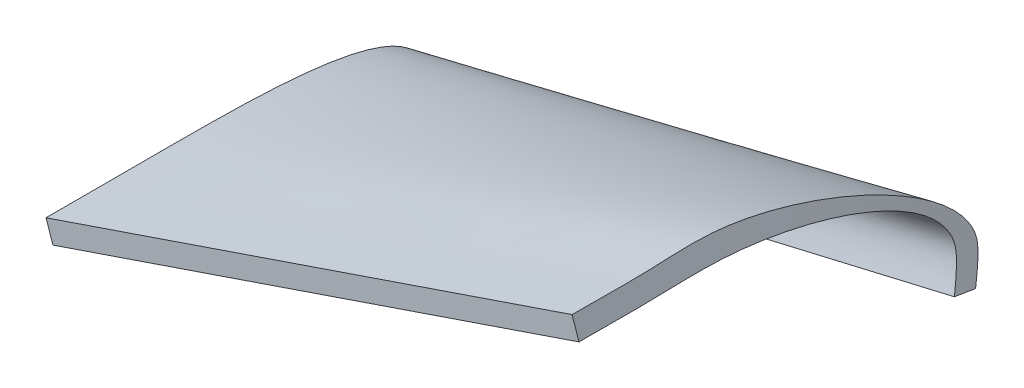
ISO-10303-21;
HEADER;
FILE_DESCRIPTION(('STEP AP214'),'2;1');
FILE_NAME('part.step','',(''),(''),'','','');
FILE_SCHEMA(('AUTOMOTIVE_DESIGN { 1 0 10303 214 1 1 1 1 }'));
ENDSEC;
DATA;
#1=APPLICATION_CONTEXT('core data for automotive mechanical design processes');
#2=APPLICATION_PROTOCOL_DEFINITION('international standard','automotive_design',2000,#1);
#3=PRODUCT_CONTEXT('',#1,'mechanical');
#4=PRODUCT('Part','Part','',(#3));
#5=PRODUCT_RELATED_PRODUCT_CATEGORY('part','',(#4));
#6=PRODUCT_DEFINITION_FORMATION('','',#4);
#7=PRODUCT_DEFINITION_CONTEXT('part definition',#1,'design');
#8=PRODUCT_DEFINITION('design','',#6,#7);
#9=PRODUCT_DEFINITION_SHAPE('','',#8);
#10=(LENGTH_UNIT() NAMED_UNIT(*) SI_UNIT(.MILLI.,.METRE.));
#11=(NAMED_UNIT(*) PLANE_ANGLE_UNIT() SI_UNIT($,.RADIAN.));
#12=(NAMED_UNIT(*) SI_UNIT($,.STERADIAN.) SOLID_ANGLE_UNIT());
#13=UNCERTAINTY_MEASURE_WITH_UNIT(LENGTH_MEASURE(1.E-05),#10,'distance_accuracy_value','');
#14=(GEOMETRIC_REPRESENTATION_CONTEXT(3) GLOBAL_UNCERTAINTY_ASSIGNED_CONTEXT((#13)) GLOBAL_UNIT_ASSIGNED_CONTEXT((#10,
#11,#12)) REPRESENTATION_CONTEXT('',''));
#15=CARTESIAN_POINT('',(0.,0.,0.));
#16=DIRECTION('',(0.,0.,1.));
#17=DIRECTION('',(1.,0.,0.));
#18=AXIS2_PLACEMENT_3D('',#15,#16,#17);
#19=CARTESIAN_POINT('',(-579.300819340137,52.2412064798877,-103.328639897074));
#20=DIRECTION('',(-0.207562785667459,0.965766665488504,-0.155603463448537));
#21=DIRECTION('',(-0.977675139751499,-0.21012215759383,0.));
#22=AXIS2_PLACEMENT_3D('',#19,#20,#21);
#23=PLANE('',#22);
#24=DIRECTION('',(0.00214335401872304,-0.15861831128964,-0.987337651139251));
#25=VECTOR('',#24,1.);
#26=CARTESIAN_POINT('',(-579.287209009447,51.2339777854459,-109.598249031383));
#27=LINE('',#26,#25);
#28=CARTESIAN_POINT('',(-579.300819340137,52.2412064798877,-103.328639897074));
#29=VERTEX_POINT('',#28);
#30=CARTESIAN_POINT('',(-579.287209009447,51.2339777854459,-109.598249031383));
#31=VERTEX_POINT('',#30);
#32=EDGE_CURVE('E287',#29,#31,#27,.T.);
#33=ORIENTED_EDGE('',*,*,#32,.T.);
#34=DIRECTION('',(0.978219349655033,0.205268066573539,-0.0308532786855163));
#35=VECTOR('',#34,1.);
#36=CARTESIAN_POINT('',(-579.287209009447,51.2339777854459,-109.598249031383));
#37=LINE('',#36,#35);
#38=CARTESIAN_POINT('',(-420.267489818465,84.602434785311,-114.613770053761));
#39=VERTEX_POINT('',#38);
#40=EDGE_CURVE('E199',#31,#39,#37,.T.);
#41=ORIENTED_EDGE('',*,*,#40,.T.);
#42=DIRECTION('',(-0.0021433540187318,0.15861831128964,0.987337651139251));
#43=VECTOR('',#42,1.);
#44=CARTESIAN_POINT('',(-420.267489818465,84.602434785311,-114.613770053761));
#45=LINE('',#44,#43);
#46=CARTESIAN_POINT('',(-420.281100149154,85.6096634797528,-108.344160919452));
#47=VERTEX_POINT('',#46);
#48=EDGE_CURVE('E79',#39,#47,#45,.T.);
#49=ORIENTED_EDGE('',*,*,#48,.T.);
#50=DIRECTION('',(-0.978219349655033,-0.205268066573539,0.0308532786855166));
#51=VECTOR('',#50,1.);
#52=CARTESIAN_POINT('',(-579.300819340137,52.2412064798877,-103.328639897074));
#53=LINE('',#52,#51);
#54=EDGE_CURVE('E84',#47,#29,#53,.T.);
#55=ORIENTED_EDGE('',*,*,#54,.T.);
#56=EDGE_LOOP('',(#33,#41,#49,#55));
#57=FACE_BOUND('',#56,.T.);
#58=ADVANCED_FACE('F42',(#57),#23,.F.);
#59=CARTESIAN_POINT('',(-423.469931206114,126.579907115653,0.));
#60=DIRECTION('',(0.,0.,-1.));
#61=DIRECTION('',(-1.,0.,0.));
#62=AXIS2_PLACEMENT_3D('',#59,#60,#61);
#63=PLANE('',#62);
#64=DIRECTION('',(-0.322399616776356,0.946603658931476,0.));
#65=VECTOR('',#64,1.);
#66=CARTESIAN_POINT('',(-425.517168772643,132.590840349868,0.));
#67=LINE('',#66,#65);
#68=CARTESIAN_POINT('',(-423.469931206114,126.579907115653,0.));
#69=VERTEX_POINT('',#68);
#70=CARTESIAN_POINT('',(-425.517168772643,132.590840349868,0.));
#71=VERTEX_POINT('',#70);
#72=EDGE_CURVE('E97',#69,#71,#67,.T.);
#73=ORIENTED_EDGE('',*,*,#72,.T.);
#74=DIRECTION('',(-0.946603658931477,-0.322399616776355,0.));
#75=VECTOR('',#74,1.);
#76=CARTESIAN_POINT('',(-581.788076139738,79.3672127280231,0.));
#77=LINE('',#76,#75);
#78=CARTESIAN_POINT('',(-581.788076139738,79.3672127280231,0.));
#79=VERTEX_POINT('',#78);
#80=EDGE_CURVE('E12',#71,#79,#77,.T.);
#81=ORIENTED_EDGE('',*,*,#80,.T.);
#82=DIRECTION('',(0.322399616776364,-0.946603658931474,0.));
#83=VECTOR('',#82,1.);
#84=CARTESIAN_POINT('',(-579.740838573208,73.3562794938083,0.));
#85=LINE('',#84,#83);
#86=CARTESIAN_POINT('',(-579.740838573208,73.3562794938083,0.));
#87=VERTEX_POINT('',#86);
#88=EDGE_CURVE('E53',#79,#87,#85,.T.);
#89=ORIENTED_EDGE('',*,*,#88,.T.);
#90=DIRECTION('',(0.946603658931477,0.322399616776355,0.));
#91=VECTOR('',#90,1.);
#92=CARTESIAN_POINT('',(-423.469931206114,126.579907115653,0.));
#93=LINE('',#92,#91);
#94=EDGE_CURVE('E62',#87,#69,#93,.T.);
#95=ORIENTED_EDGE('',*,*,#94,.T.);
#96=EDGE_LOOP('',(#73,#81,#89,#95));
#97=FACE_BOUND('',#96,.T.);
#98=ADVANCED_FACE('F112',(#97),#63,.F.);
#99=CARTESIAN_POINT('',(-425.517168772643,132.590840349868,0.));
#100=CARTESIAN_POINT('',(-425.517168772643,132.590840349868,-7.29339145085368));
#101=CARTESIAN_POINT('',(-425.518101458164,132.180200188548,-22.2775853733354));
#102=CARTESIAN_POINT('',(-425.510754784445,135.414773059038,-57.4467769624574));
#103=CARTESIAN_POINT('',(-425.571410850307,108.709290744914,-118.743086594855));
#104=CARTESIAN_POINT('',(-421.997137935972,92.1315135216705,-117.557103297061));
#105=CARTESIAN_POINT('',(-420.267489818465,84.602434785311,-114.613770053761));
#106=CARTESIAN_POINT('',(-424.834756250467,130.587195938463,0.));
#107=CARTESIAN_POINT('',(-424.834756250467,130.587195938463,-7.29339145085368));
#108=CARTESIAN_POINT('',(-424.847829796403,130.21830015241,-22.239922614307));
#109=CARTESIAN_POINT('',(-424.744850738361,133.124056612687,-57.7057801169375));
#110=CARTESIAN_POINT('',(-425.59507286146,109.133368856955,-116.552738127461));
#111=CARTESIAN_POINT('',(-422.015868685535,92.5068029070358,-115.440074739727));
#112=CARTESIAN_POINT('',(-420.272026595362,84.9381776834583,-112.523900342324));
#113=CARTESIAN_POINT('',(-424.15234372829,128.583551527058,0.));
#114=CARTESIAN_POINT('',(-424.15234372829,128.583551527058,-7.29339145085368));
#115=CARTESIAN_POINT('',(-424.177558134642,128.256400116272,-22.2022598552786));
#116=CARTESIAN_POINT('',(-423.978946692278,130.833340166337,-57.9647832714175));
#117=CARTESIAN_POINT('',(-425.618734872612,109.557446968997,-114.362389660067));
#118=CARTESIAN_POINT('',(-422.034599435099,92.8820922924011,-113.323046182393));
#119=CARTESIAN_POINT('',(-420.276563372258,85.2739205816055,-110.434030630888));
#120=CARTESIAN_POINT('',(-423.469931206114,126.579907115653,0.));
#121=CARTESIAN_POINT('',(-423.469931206114,126.579907115653,-7.29339145085368));
#122=CARTESIAN_POINT('',(-423.507286472882,126.294500080134,-22.1645970962502));
#123=CARTESIAN_POINT('',(-423.213042646194,128.542623719986,-58.2237864258976));
#124=CARTESIAN_POINT('',(-425.642396883764,109.981525081038,-112.172041192672));
#125=CARTESIAN_POINT('',(-422.053330184662,93.2573816777664,-111.206017625059));
#126=CARTESIAN_POINT('',(-420.281100149154,85.6096634797528,-108.344160919452));
#127=B_SPLINE_SURFACE_WITH_KNOTS('',3,3,((#99,#100,#101,#102,#103,#104,#105),(#106,#107,#108,
#109,#110,#111,#112),(#113,#114,#115,#116,#117,#118,#119),(#120,#121,#122,#123,#124,#125,#126)),
.UNSPECIFIED.,.F.,.F.,.F.,(4,4),(4,1,1,1,4),(0.,1.),(0.,0.170627361361101,0.341254722722189,
0.896010158461833,1.),.UNSPECIFIED.);
#128=CARTESIAN_POINT('',(-423.469931206114,126.579907115653,0.));
#129=CARTESIAN_POINT('',(-423.469931206114,126.579907115653,-7.29339145085368));
#130=CARTESIAN_POINT('',(-423.507286472882,126.294500080134,-22.1645970962502));
#131=CARTESIAN_POINT('',(-423.213042646194,128.542623719986,-58.2237864258976));
#132=CARTESIAN_POINT('',(-425.642396883764,109.981525081038,-112.172041192672));
#133=CARTESIAN_POINT('',(-422.053330184662,93.2573816777664,-111.206017625059));
#134=CARTESIAN_POINT('',(-420.281100149154,85.6096634797528,-108.344160919452));
#135=B_SPLINE_CURVE_WITH_KNOTS('',3,(#128,#129,#130,#131,#132,#133,#134),.UNSPECIFIED.,.F.,.F.,
(4,1,1,1,4),(0.,0.170627361361101,0.341254722722189,0.896010158461833,1.),.UNSPECIFIED.);
#136=EDGE_CURVE('E103',#69,#47,#135,.T.);
#137=CARTESIAN_POINT('',(-425.517168772643,132.590840349868,0.));
#138=CARTESIAN_POINT('',(-425.517168772643,132.590840349868,-7.29339145085368));
#139=CARTESIAN_POINT('',(-425.518101458164,132.180200188548,-22.2775853733354));
#140=CARTESIAN_POINT('',(-425.510754784445,135.414773059038,-57.4467769624574));
#141=CARTESIAN_POINT('',(-425.571410850307,108.709290744914,-118.743086594855));
#142=CARTESIAN_POINT('',(-421.997137935972,92.1315135216705,-117.557103297061));
#143=CARTESIAN_POINT('',(-420.267489818465,84.602434785311,-114.613770053761));
#144=B_SPLINE_CURVE_WITH_KNOTS('',3,(#137,#138,#139,#140,#141,#142,#143),.UNSPECIFIED.,.F.,.F.,
(4,1,1,1,4),(0.,0.170627361361101,0.341254722722189,0.896010158461833,1.),.UNSPECIFIED.);
#145=EDGE_CURVE('E94',#39,#71,#144,.F.);
#146=ORIENTED_EDGE('',*,*,#72,.F.);
#147=ORIENTED_EDGE('',*,*,#136,.T.);
#148=ORIENTED_EDGE('',*,*,#48,.F.);
#149=ORIENTED_EDGE('',*,*,#145,.T.);
#150=EDGE_LOOP('',(#146,#147,#148,#149));
#151=FACE_BOUND('',#150,.T.);
#152=ADVANCED_FACE('F95',(#151),#127,.T.);
#153=CARTESIAN_POINT('',(-423.469931206114,126.579907115653,0.));
#154=CARTESIAN_POINT('',(-423.469931206114,126.579907115653,-7.29339145085368));
#155=CARTESIAN_POINT('',(-423.507286472882,126.294500080134,-22.1645970962502));
#156=CARTESIAN_POINT('',(-423.213042646194,128.542623719986,-58.2237864258976));
#157=CARTESIAN_POINT('',(-425.642396883764,109.981525081038,-112.172041192672));
#158=CARTESIAN_POINT('',(-422.053330184662,93.2573816777664,-111.206017625059));
#159=CARTESIAN_POINT('',(-420.281100149154,85.6096634797528,-108.344160919452));
#160=CARTESIAN_POINT('',(-475.560233661812,108.838697908371,0.));
#161=CARTESIAN_POINT('',(-475.560233661812,108.838697908371,-7.29339145085368));
#162=CARTESIAN_POINT('',(-475.613620604471,108.666264519705,-22.1446044517832));
#163=CARTESIAN_POINT('',(-475.193096815931,110.024505659964,-58.3612739100052));
#164=CARTESIAN_POINT('',(-478.665051552206,98.8105104272627,-111.009331415235));
#165=CARTESIAN_POINT('',(-475.082407209979,82.3593762606973,-109.28912522932));
#166=CARTESIAN_POINT('',(-473.287673212815,74.4868444797978,-106.672320578659));
#167=CARTESIAN_POINT('',(-527.65053611751,91.0974887010898,0.));
#168=CARTESIAN_POINT('',(-527.65053611751,91.0974887010898,-7.29339145085368));
#169=CARTESIAN_POINT('',(-527.71995473606,91.0380289592755,-22.1246118073161));
#170=CARTESIAN_POINT('',(-527.173150985669,91.5063875999419,-58.4987613941128));
#171=CARTESIAN_POINT('',(-531.687706220647,87.6394957734875,-109.846621637798));
#172=CARTESIAN_POINT('',(-528.111484235297,71.4613708436282,-107.372232833582));
#173=CARTESIAN_POINT('',(-526.294246276476,63.3640254798427,-105.000480237866));
#174=CARTESIAN_POINT('',(-579.740838573208,73.3562794938083,0.));
#175=CARTESIAN_POINT('',(-579.740838573208,73.3562794938083,-7.29339145085368));
#176=CARTESIAN_POINT('',(-579.82628886765,73.4097933988461,-22.104619162849));
#177=CARTESIAN_POINT('',(-579.153205155406,72.9882695399199,-58.6362488782205));
#178=CARTESIAN_POINT('',(-584.710360889088,76.4684811197122,-108.68391186036));
#179=CARTESIAN_POINT('',(-581.140561260614,60.563365426559,-105.455340437844));
#180=CARTESIAN_POINT('',(-579.300819340137,52.2412064798877,-103.328639897074));
#181=B_SPLINE_SURFACE_WITH_KNOTS('',3,3,((#153,#154,#155,#156,#157,#158,#159),(#160,#161,#162,
#163,#164,#165,#166),(#167,#168,#169,#170,#171,#172,#173),(#174,#175,#176,#177,#178,#179,#180)),
.UNSPECIFIED.,.F.,.F.,.F.,(4,4),(4,1,1,1,4),(0.,1.),(0.,0.170627361361101,0.341254722722189,
0.896010158461833,1.),.UNSPECIFIED.);
#182=CARTESIAN_POINT('',(-579.740838573208,73.3562794938083,0.));
#183=CARTESIAN_POINT('',(-579.740838573208,73.3562794938083,-7.29339145085368));
#184=CARTESIAN_POINT('',(-579.82628886765,73.4097933988461,-22.104619162849));
#185=CARTESIAN_POINT('',(-579.153205155406,72.9882695399199,-58.6362488782205));
#186=CARTESIAN_POINT('',(-584.710360889088,76.4684811197122,-108.68391186036));
#187=CARTESIAN_POINT('',(-581.140561260614,60.563365426559,-105.455340437844));
#188=CARTESIAN_POINT('',(-579.300819340137,52.2412064798877,-103.328639897074));
#189=B_SPLINE_CURVE_WITH_KNOTS('',3,(#182,#183,#184,#185,#186,#187,#188),.UNSPECIFIED.,.F.,.F.,
(4,1,1,1,4),(0.,0.170627361361101,0.341254722722189,0.896010158461833,1.),.UNSPECIFIED.);
#190=EDGE_CURVE('E104',#87,#29,#189,.T.);
#191=ORIENTED_EDGE('',*,*,#94,.F.);
#192=ORIENTED_EDGE('',*,*,#190,.T.);
#193=ORIENTED_EDGE('',*,*,#54,.F.);
#194=ORIENTED_EDGE('',*,*,#136,.F.);
#195=EDGE_LOOP('',(#191,#192,#193,#194));
#196=FACE_BOUND('',#195,.T.);
#197=ADVANCED_FACE('F220',(#196),#181,.T.);
#198=CARTESIAN_POINT('',(-581.788076139738,79.3672127280231,0.));
#199=CARTESIAN_POINT('',(-581.788076139738,79.3672127280231,-7.29339145085368));
#200=CARTESIAN_POINT('',(-581.836636831491,79.2974406833996,-22.2098986634519));
#201=CARTESIAN_POINT('',(-581.45412895498,79.8470283368158,-57.9122519257494));
#202=CARTESIAN_POINT('',(-584.612214346833,75.3094884680262,-114.806638892109));
#203=CARTESIAN_POINT('',(-581.094658286588,59.3945976766728,-111.976263533899));
#204=CARTESIAN_POINT('',(-579.287209009447,51.2339777854459,-109.598249031383));
#205=CARTESIAN_POINT('',(-529.69777368404,97.1084219353046,0.));
#206=CARTESIAN_POINT('',(-529.69777368404,97.1084219353046,-7.29339145085368));
#207=CARTESIAN_POINT('',(-529.730458373715,96.9250271851158,-22.2324609000797));
#208=CARTESIAN_POINT('',(-529.473004231468,98.3696099108898,-57.7570936046521));
#209=CARTESIAN_POINT('',(-531.598613181324,86.4427558936554,-116.118788126358));
#210=CARTESIAN_POINT('',(-528.062151503049,70.3069029583387,-113.836543454953));
#211=CARTESIAN_POINT('',(-526.280635945787,62.3567967854009,-111.270089372175));
#212=CARTESIAN_POINT('',(-477.607471228342,114.849631142586,0.));
#213=CARTESIAN_POINT('',(-477.607471228342,114.849631142586,-7.29339145085368));
#214=CARTESIAN_POINT('',(-477.62427991594,114.552613686832,-22.2550231367076));
#215=CARTESIAN_POINT('',(-477.491879507957,116.892191484964,-57.6019352835548));
#216=CARTESIAN_POINT('',(-478.585012015815,97.5760233192846,-117.430937360607));
#217=CARTESIAN_POINT('',(-475.029644719511,81.2192082400046,-115.696823376007));
#218=CARTESIAN_POINT('',(-473.274062882126,73.479615785356,-112.941929712968));
#219=CARTESIAN_POINT('',(-425.517168772643,132.590840349868,0.));
#220=CARTESIAN_POINT('',(-425.517168772643,132.590840349868,-7.29339145085368));
#221=CARTESIAN_POINT('',(-425.518101458164,132.180200188548,-22.2775853733354));
#222=CARTESIAN_POINT('',(-425.510754784445,135.414773059038,-57.4467769624574));
#223=CARTESIAN_POINT('',(-425.571410850307,108.709290744914,-118.743086594855));
#224=CARTESIAN_POINT('',(-421.997137935972,92.1315135216705,-117.557103297061));
#225=CARTESIAN_POINT('',(-420.267489818465,84.602434785311,-114.613770053761));
#226=B_SPLINE_SURFACE_WITH_KNOTS('',3,3,((#198,#199,#200,#201,#202,#203,#204),(#205,#206,#207,
#208,#209,#210,#211),(#212,#213,#214,#215,#216,#217,#218),(#219,#220,#221,#222,#223,#224,#225)),
.UNSPECIFIED.,.F.,.F.,.F.,(4,4),(4,1,1,1,4),(0.,1.),(0.,0.170627361361101,0.341254722722189,
0.896010158461833,1.),.UNSPECIFIED.);
#227=CARTESIAN_POINT('',(-581.788076139738,79.3672127280231,0.));
#228=CARTESIAN_POINT('',(-581.788076139738,79.3672127280231,-7.29339145085368));
#229=CARTESIAN_POINT('',(-581.836636831491,79.2974406833996,-22.2098986634519));
#230=CARTESIAN_POINT('',(-581.45412895498,79.8470283368158,-57.9122519257494));
#231=CARTESIAN_POINT('',(-584.612214346833,75.3094884680262,-114.806638892109));
#232=CARTESIAN_POINT('',(-581.094658286588,59.3945976766728,-111.976263533899));
#233=CARTESIAN_POINT('',(-579.287209009447,51.2339777854459,-109.598249031383));
#234=B_SPLINE_CURVE_WITH_KNOTS('',3,(#227,#228,#229,#230,#231,#232,#233),.UNSPECIFIED.,.F.,.F.,
(4,1,1,1,4),(0.,0.170627361361101,0.341254722722189,0.896010158461833,1.),.UNSPECIFIED.);
#235=EDGE_CURVE('E109',#79,#31,#234,.T.);
#236=ORIENTED_EDGE('',*,*,#80,.F.);
#237=ORIENTED_EDGE('',*,*,#145,.F.);
#238=ORIENTED_EDGE('',*,*,#40,.F.);
#239=ORIENTED_EDGE('',*,*,#235,.F.);
#240=EDGE_LOOP('',(#236,#237,#238,#239));
#241=FACE_BOUND('',#240,.T.);
#242=ADVANCED_FACE('F108',(#241),#226,.T.);
#243=CARTESIAN_POINT('',(-579.740838573208,73.3562794938083,0.));
#244=CARTESIAN_POINT('',(-579.740838573208,73.3562794938083,-7.29339145085368));
#245=CARTESIAN_POINT('',(-579.82628886765,73.4097933988461,-22.104619162849));
#246=CARTESIAN_POINT('',(-579.153205155406,72.9882695399199,-58.6362488782205));
#247=CARTESIAN_POINT('',(-584.710360889088,76.4684811197122,-108.68391186036));
#248=CARTESIAN_POINT('',(-581.140561260614,60.563365426559,-105.455340437844));
#249=CARTESIAN_POINT('',(-579.300819340137,52.2412064798877,-103.328639897074));
#250=CARTESIAN_POINT('',(-580.423251095384,75.3599239052132,0.));
#251=CARTESIAN_POINT('',(-580.423251095384,75.3599239052132,-7.29339145085368));
#252=CARTESIAN_POINT('',(-580.496404855597,75.3723424936973,-22.1397123297166));
#253=CARTESIAN_POINT('',(-579.920179755264,75.2745224722185,-58.3949165607301));
#254=CARTESIAN_POINT('',(-584.677645375003,76.082150235817,-110.724820870943));
#255=CARTESIAN_POINT('',(-581.125260269272,60.1737761765969,-107.628981469862));
#256=CARTESIAN_POINT('',(-579.29628256324,51.9054635817404,-105.41850960851));
#257=CARTESIAN_POINT('',(-581.105663617561,77.3635683166182,0.));
#258=CARTESIAN_POINT('',(-581.105663617561,77.3635683166182,-7.29339145085368));
#259=CARTESIAN_POINT('',(-581.166520843543,77.3348915885484,-22.1748054965843));
#260=CARTESIAN_POINT('',(-580.687154355122,77.5607754045171,-58.1535842432398));
#261=CARTESIAN_POINT('',(-584.644929860919,75.6958193519216,-112.765729881526));
#262=CARTESIAN_POINT('',(-581.10995927793,59.7841869266349,-109.802622501881));
#263=CARTESIAN_POINT('',(-579.291745786344,51.5697206835931,-107.508379319946));
#264=CARTESIAN_POINT('',(-581.788076139738,79.3672127280231,0.));
#265=CARTESIAN_POINT('',(-581.788076139738,79.3672127280231,-7.29339145085368));
#266=CARTESIAN_POINT('',(-581.836636831491,79.2974406833996,-22.2098986634519));
#267=CARTESIAN_POINT('',(-581.45412895498,79.8470283368158,-57.9122519257494));
#268=CARTESIAN_POINT('',(-584.612214346833,75.3094884680262,-114.806638892109));
#269=CARTESIAN_POINT('',(-581.094658286588,59.3945976766728,-111.976263533899));
#270=CARTESIAN_POINT('',(-579.287209009447,51.2339777854459,-109.598249031383));
#271=B_SPLINE_SURFACE_WITH_KNOTS('',3,3,((#243,#244,#245,#246,#247,#248,#249),(#250,#251,#252,
#253,#254,#255,#256),(#257,#258,#259,#260,#261,#262,#263),(#264,#265,#266,#267,#268,#269,#270)),
.UNSPECIFIED.,.F.,.F.,.F.,(4,4),(4,1,1,1,4),(0.,1.),(0.,0.170627361361101,0.341254722722189,
0.896010158461833,1.),.UNSPECIFIED.);
#272=ORIENTED_EDGE('',*,*,#88,.F.);
#273=ORIENTED_EDGE('',*,*,#235,.T.);
#274=ORIENTED_EDGE('',*,*,#32,.F.);
#275=ORIENTED_EDGE('',*,*,#190,.F.);
#276=EDGE_LOOP('',(#272,#273,#274,#275));
#277=FACE_BOUND('',#276,.T.);
#278=ADVANCED_FACE('F132',(#277),#271,.T.);
#279=CLOSED_SHELL('',(#58,#98,#152,#197,#242,#278));
#280=MANIFOLD_SOLID_BREP('B2',#279);
#281=ADVANCED_BREP_SHAPE_REPRESENTATION('',(#18,#280),#14);
#282=SHAPE_DEFINITION_REPRESENTATION(#9,#281);
ENDSEC;
END-ISO-10303-21;
